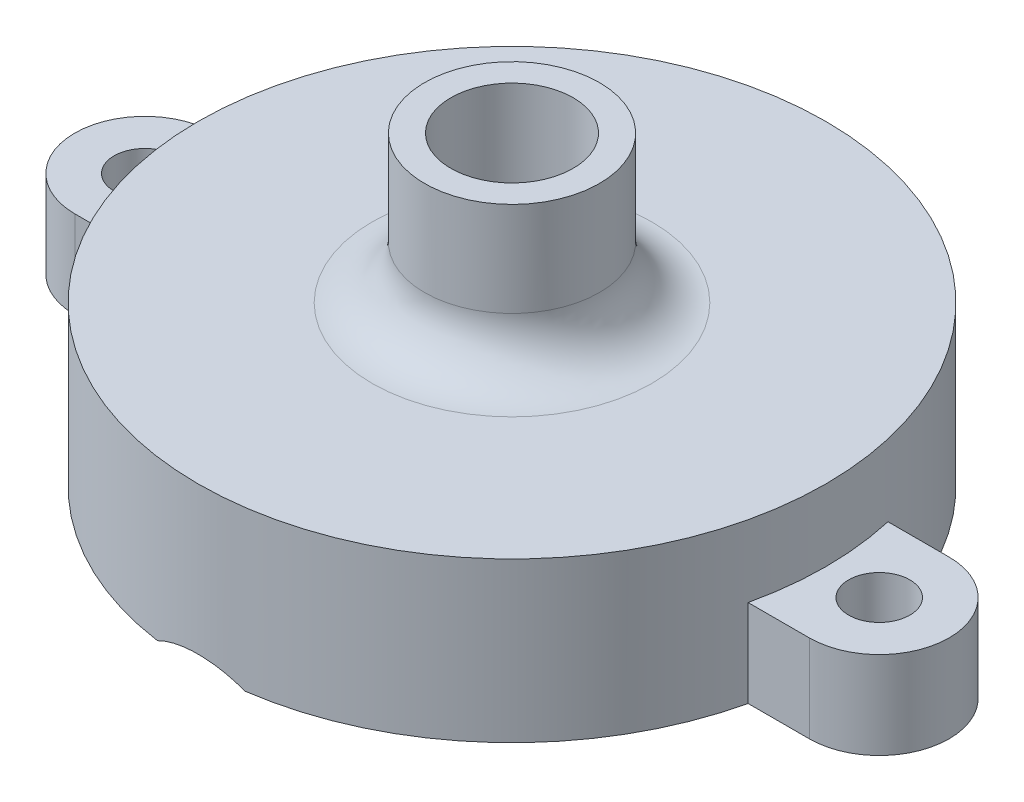
ISO-10303-21;
HEADER;
FILE_DESCRIPTION(('STEP AP214'),'2;1');
FILE_NAME('part.step','',(''),(''),'','','');
FILE_SCHEMA(('AUTOMOTIVE_DESIGN { 1 0 10303 214 1 1 1 1 }'));
ENDSEC;
DATA;
#1=APPLICATION_CONTEXT('core data for automotive mechanical design processes');
#2=APPLICATION_PROTOCOL_DEFINITION('international standard','automotive_design',2000,#1);
#3=PRODUCT_CONTEXT('',#1,'mechanical');
#4=PRODUCT('Part','Part','',(#3));
#5=PRODUCT_RELATED_PRODUCT_CATEGORY('part','',(#4));
#6=PRODUCT_DEFINITION_FORMATION('','',#4);
#7=PRODUCT_DEFINITION_CONTEXT('part definition',#1,'design');
#8=PRODUCT_DEFINITION('design','',#6,#7);
#9=PRODUCT_DEFINITION_SHAPE('','',#8);
#10=(LENGTH_UNIT() NAMED_UNIT(*) SI_UNIT(.MILLI.,.METRE.));
#11=(NAMED_UNIT(*) PLANE_ANGLE_UNIT() SI_UNIT($,.RADIAN.));
#12=(NAMED_UNIT(*) SI_UNIT($,.STERADIAN.) SOLID_ANGLE_UNIT());
#13=UNCERTAINTY_MEASURE_WITH_UNIT(LENGTH_MEASURE(1.E-05),#10,'distance_accuracy_value','');
#14=(GEOMETRIC_REPRESENTATION_CONTEXT(3) GLOBAL_UNCERTAINTY_ASSIGNED_CONTEXT((#13)) GLOBAL_UNIT_ASSIGNED_CONTEXT((#10,
#11,#12)) REPRESENTATION_CONTEXT('',''));
#15=CARTESIAN_POINT('',(0.,0.,0.));
#16=DIRECTION('',(0.,0.,1.));
#17=DIRECTION('',(1.,0.,0.));
#18=AXIS2_PLACEMENT_3D('',#15,#16,#17);
#19=CARTESIAN_POINT('',(0.,0.,0.));
#20=DIRECTION('',(0.,-1.,0.));
#21=DIRECTION('',(0.,0.,-1.));
#22=AXIS2_PLACEMENT_3D('',#19,#20,#21);
#23=CYLINDRICAL_SURFACE('',#22,17.95);
#24=CARTESIAN_POINT('',(0.,7.6,0.));
#25=DIRECTION('',(0.,-1.,0.));
#26=DIRECTION('',(0.,0.,-1.));
#27=AXIS2_PLACEMENT_3D('',#24,#25,#26);
#28=CIRCLE('',#27,17.95);
#29=CARTESIAN_POINT('',(0.,7.6,-17.95));
#30=VERTEX_POINT('',#29);
#31=EDGE_CURVE('E190',#30,#30,#28,.T.);
#32=ORIENTED_EDGE('',*,*,#31,.T.);
#33=EDGE_LOOP('',(#32));
#34=FACE_BOUND('',#33,.T.);
#35=CARTESIAN_POINT('',(0.,-1.5,0.));
#36=DIRECTION('',(0.,-1.,0.));
#37=DIRECTION('',(0.,0.,-1.));
#38=AXIS2_PLACEMENT_3D('',#35,#36,#37);
#39=CIRCLE('',#38,17.95);
#40=CARTESIAN_POINT('',(-2.5,-1.5,17.7750527425378));
#41=VERTEX_POINT('',#40);
#42=CARTESIAN_POINT('',(-17.4986428045149,-1.5,3.99999999999999));
#43=VERTEX_POINT('',#42);
#44=EDGE_CURVE('E194',#41,#43,#39,.T.);
#45=ORIENTED_EDGE('',*,*,#44,.F.);
#46=CARTESIAN_POINT('',(-2.5,-1.5,17.7750527425378));
#47=CARTESIAN_POINT('',(-2.38165113708189,-1.43165597801078,17.7917083045529));
#48=CARTESIAN_POINT('',(-2.26039505101105,-1.36813357291319,17.8075474890646));
#49=CARTESIAN_POINT('',(-2.01287040770248,-1.25114693819213,17.8372165345942));
#50=CARTESIAN_POINT('',(-1.88660122710851,-1.19768396418829,17.8510461447277));
#51=CARTESIAN_POINT('',(-1.62993569625732,-1.10126845139301,17.8763098734586));
#52=CARTESIAN_POINT('',(-1.49954108462071,-1.05831154984302,17.8877449861119));
#53=CARTESIAN_POINT('',(-1.23547409439407,-0.983226774818197,17.9079208405242));
#54=CARTESIAN_POINT('',(-1.10180193391693,-0.951098182832611,17.9166617610528));
#55=CARTESIAN_POINT('',(-0.831957783813571,-0.897908565383739,17.9312192555116));
#56=CARTESIAN_POINT('',(-0.69578315058931,-0.876860033971758,17.9370325278613));
#57=CARTESIAN_POINT('',(-0.422016425013952,-0.846064175857757,17.9455610811594));
#58=CARTESIAN_POINT('',(-0.284423855339676,-0.836320789132908,17.9482752820394));
#59=CARTESIAN_POINT('',(-0.00891287370729469,-0.828236496376056,17.9505262796558));
#60=CARTESIAN_POINT('',(0.129005447090246,-0.829892708581293,17.9500638794216));
#61=CARTESIAN_POINT('',(0.404187339104188,-0.844586173935835,17.945976368115));
#62=CARTESIAN_POINT('',(0.541450910756215,-0.857623419511901,17.9423512591473));
#63=CARTESIAN_POINT('',(0.812305514344321,-0.894686955672647,17.9321152527304));
#64=CARTESIAN_POINT('',(0.945920855748549,-0.918548409623978,17.9255491603667));
#65=CARTESIAN_POINT('',(1.21056632365078,-0.976995543020805,17.9096229900142));
#66=CARTESIAN_POINT('',(1.34159733202195,-1.01157749444263,17.9002638833306));
#67=CARTESIAN_POINT('',(1.60008414794944,-1.09113972239899,17.8790109850652));
#68=CARTESIAN_POINT('',(1.7275437499539,-1.13610845430531,17.8671200087271));
#69=CARTESIAN_POINT('',(1.97815972441054,-1.23610156060522,17.8411109999684));
#70=CARTESIAN_POINT('',(2.10131836907358,-1.29112052668128,17.8269941659017));
#71=CARTESIAN_POINT('',(2.26910861070084,-1.37435293084501,17.806063908259));
#72=CARTESIAN_POINT('',(2.31589669281383,-1.39849147348164,17.8000368905864));
#73=CARTESIAN_POINT('',(2.40859618045207,-1.44818400055934,17.7877302085256));
#74=CARTESIAN_POINT('',(2.45450871759253,-1.47373596407677,17.7814509082006));
#75=CARTESIAN_POINT('',(2.5,-1.5,17.7750527425378));
#76=B_SPLINE_CURVE_WITH_KNOTS('',3,(#46,#47,#48,#49,#50,#51,#52,#53,#54,#55,#56,#57,#58,#59,#60,
#61,#62,#63,#64,#65,#66,#67,#68,#69,#70,#71,#72,#73,#74,#75),.UNSPECIFIED.,.F.,.F.,(4,2,2,2,2,2,
2,2,2,2,2,2,2,2,4),(0.,0.412923213001316,0.825897932995578,1.23870086854427,1.65147640722452,
2.06471640643398,2.47810038147286,2.89137985890689,3.30465906133405,3.71184560030374,
4.11889069980619,4.52548553830724,4.93186221767634,5.09081642814064,5.2495489609334),.UNSPECIFIED.);
#77=CARTESIAN_POINT('',(2.5,-1.5,17.7750527425378));
#78=VERTEX_POINT('',#77);
#79=EDGE_CURVE('E55',#41,#78,#76,.T.);
#80=ORIENTED_EDGE('',*,*,#79,.T.);
#81=CARTESIAN_POINT('',(17.4986428045149,-1.5,3.99999999999999));
#82=VERTEX_POINT('',#81);
#83=EDGE_CURVE('E200',#82,#78,#39,.T.);
#84=ORIENTED_EDGE('',*,*,#83,.F.);
#85=DIRECTION('',(0.,-1.,0.));
#86=VECTOR('',#85,1.);
#87=CARTESIAN_POINT('',(17.4986428045149,3.5,3.99999999999999));
#88=LINE('',#87,#86);
#89=CARTESIAN_POINT('',(17.4986428045149,3.5,4.));
#90=VERTEX_POINT('',#89);
#91=EDGE_CURVE('E259',#90,#82,#88,.T.);
#92=ORIENTED_EDGE('',*,*,#91,.F.);
#93=CARTESIAN_POINT('',(0.,3.5,0.));
#94=DIRECTION('',(0.,-1.,0.));
#95=DIRECTION('',(0.,0.,1.));
#96=AXIS2_PLACEMENT_3D('',#93,#94,#95);
#97=CIRCLE('',#96,17.95);
#98=CARTESIAN_POINT('',(17.4986428045149,3.5,-4.));
#99=VERTEX_POINT('',#98);
#100=EDGE_CURVE('E261',#99,#90,#97,.T.);
#101=ORIENTED_EDGE('',*,*,#100,.F.);
#102=DIRECTION('',(0.,-1.,0.));
#103=VECTOR('',#102,1.);
#104=CARTESIAN_POINT('',(17.4986428045149,3.5,-4.));
#105=LINE('',#104,#103);
#106=CARTESIAN_POINT('',(17.4986428045149,-1.5,-4.));
#107=VERTEX_POINT('',#106);
#108=EDGE_CURVE('E263',#99,#107,#105,.T.);
#109=ORIENTED_EDGE('',*,*,#108,.T.);
#110=CARTESIAN_POINT('',(-17.4986428045149,-1.5,-4.));
#111=VERTEX_POINT('',#110);
#112=EDGE_CURVE('E195',#111,#107,#39,.T.);
#113=ORIENTED_EDGE('',*,*,#112,.F.);
#114=DIRECTION('',(0.,-1.,0.));
#115=VECTOR('',#114,1.);
#116=CARTESIAN_POINT('',(-17.4986428045149,3.5,-4.));
#117=LINE('',#116,#115);
#118=CARTESIAN_POINT('',(-17.4986428045149,3.5,-4.));
#119=VERTEX_POINT('',#118);
#120=EDGE_CURVE('E311',#119,#111,#117,.T.);
#121=ORIENTED_EDGE('',*,*,#120,.F.);
#122=CARTESIAN_POINT('',(0.,3.5,0.));
#123=DIRECTION('',(0.,1.,0.));
#124=DIRECTION('',(0.,0.,1.));
#125=AXIS2_PLACEMENT_3D('',#122,#123,#124);
#126=CIRCLE('',#125,17.95);
#127=CARTESIAN_POINT('',(-17.4986428045149,3.5,3.99999999999999));
#128=VERTEX_POINT('',#127);
#129=EDGE_CURVE('E293',#119,#128,#126,.T.);
#130=ORIENTED_EDGE('',*,*,#129,.T.);
#131=DIRECTION('',(0.,-1.,0.));
#132=VECTOR('',#131,1.);
#133=CARTESIAN_POINT('',(-17.4986428045149,3.5,3.99999999999999));
#134=LINE('',#133,#132);
#135=EDGE_CURVE('E168',#128,#43,#134,.T.);
#136=ORIENTED_EDGE('',*,*,#135,.T.);
#137=EDGE_LOOP('',(#45,#80,#84,#92,#101,#109,#113,#121,#130,#136));
#138=FACE_BOUND('',#137,.T.);
#139=ADVANCED_FACE('F39',(#34,#138),#23,.T.);
#140=CARTESIAN_POINT('',(0.,0.,0.));
#141=DIRECTION('',(0.,-1.,0.));
#142=DIRECTION('',(0.,0.,-1.));
#143=AXIS2_PLACEMENT_3D('',#140,#141,#142);
#144=CYLINDRICAL_SURFACE('',#143,15.45);
#145=CARTESIAN_POINT('',(0.,6.,0.));
#146=DIRECTION('',(0.,-1.,0.));
#147=DIRECTION('',(0.,0.,-1.));
#148=AXIS2_PLACEMENT_3D('',#145,#146,#147);
#149=CIRCLE('',#148,15.45);
#150=CARTESIAN_POINT('',(0.,6.,-15.45));
#151=VERTEX_POINT('',#150);
#152=EDGE_CURVE('E212',#151,#151,#149,.T.);
#153=ORIENTED_EDGE('',*,*,#152,.F.);
#154=EDGE_LOOP('',(#153));
#155=FACE_BOUND('',#154,.T.);
#156=CARTESIAN_POINT('',(0.,-1.5,0.));
#157=DIRECTION('',(0.,1.,0.));
#158=DIRECTION('',(0.,0.,1.));
#159=AXIS2_PLACEMENT_3D('',#156,#157,#158);
#160=CIRCLE('',#159,15.45);
#161=CARTESIAN_POINT('',(3.5,-1.5,15.048338778749));
#162=VERTEX_POINT('',#161);
#163=CARTESIAN_POINT('',(2.5,-1.5,15.2463930160546));
#164=VERTEX_POINT('',#163);
#165=EDGE_CURVE('E154',#162,#164,#160,.F.);
#166=ORIENTED_EDGE('',*,*,#165,.T.);
#167=CARTESIAN_POINT('',(2.5,-1.5,15.2463930160546));
#168=CARTESIAN_POINT('',(2.38281995173812,-1.43233148674007,15.2656187256161));
#169=CARTESIAN_POINT('',(2.26275670290411,-1.3693699615778,15.2839078279045));
#170=CARTESIAN_POINT('',(2.01762719800361,-1.25327854991161,15.318188728294));
#171=CARTESIAN_POINT('',(1.89256005056537,-1.2001504246534,15.3341801147402));
#172=CARTESIAN_POINT('',(1.63824674441847,-1.10417483114348,15.3634322251576));
#173=CARTESIAN_POINT('',(1.50900118321424,-1.06132590030279,15.3766933375714));
#174=CARTESIAN_POINT('',(1.24719469528621,-0.986260231077899,15.4001386027246));
#175=CARTESIAN_POINT('',(1.11463404198737,-0.954042618925864,15.4103230083269));
#176=CARTESIAN_POINT('',(0.846922707856259,-0.900483748090567,15.4273535441234));
#177=CARTESIAN_POINT('',(0.711768613493579,-0.879158013592323,15.4341949088873));
#178=CARTESIAN_POINT('',(0.439986857041939,-0.847644492283323,15.4443325711815));
#179=CARTESIAN_POINT('',(0.303358697824834,-0.837460589674274,15.4476276324131));
#180=CARTESIAN_POINT('',(0.0297487092738467,-0.828343015097297,15.4505768374435));
#181=CARTESIAN_POINT('',(-0.107232936424439,-0.829404357804788,15.4502325946452));
#182=CARTESIAN_POINT('',(-0.380590416904757,-0.842755348489234,15.4459164918666));
#183=CARTESIAN_POINT('',(-0.516966252579595,-0.855044979913104,15.4419446372343));
#184=CARTESIAN_POINT('',(-0.78542465972773,-0.890382527067282,15.4305963169205));
#185=CARTESIAN_POINT('',(-0.917538833002115,-0.91321322370042,15.423288625506));
#186=CARTESIAN_POINT('',(-1.1792581813869,-0.969339536075635,15.4054875792462));
#187=CARTESIAN_POINT('',(-1.30886420326875,-1.00263155217468,15.3949953202233));
#188=CARTESIAN_POINT('',(-1.56462776078282,-1.07936356555427,15.3711068697123));
#189=CARTESIAN_POINT('',(-1.69078824095913,-1.1227945743614,15.3577132511067));
#190=CARTESIAN_POINT('',(-1.93893003404423,-1.21945832301638,15.3283608746693));
#191=CARTESIAN_POINT('',(-2.06091340327422,-1.2726861553246,15.31240340166));
#192=CARTESIAN_POINT('',(-2.23478992439088,-1.35694401763126,15.2876170388389));
#193=CARTESIAN_POINT('',(-2.28863779625233,-1.38425482403168,15.2796448539173));
#194=CARTESIAN_POINT('',(-2.3951760488629,-1.44073533100604,15.2633066713848));
#195=CARTESIAN_POINT('',(-2.44786814973157,-1.46990197560621,15.2549413268314));
#196=CARTESIAN_POINT('',(-2.5,-1.5,15.2463930160546));
#197=B_SPLINE_CURVE_WITH_KNOTS('',3,(#167,#168,#169,#170,#171,#172,#173,#174,#175,#176,#177,
#178,#179,#180,#181,#182,#183,#184,#185,#186,#187,#188,#189,#190,#191,#192,#193,#194,#195,#196),
.UNSPECIFIED.,.F.,.F.,(4,2,2,2,2,2,2,2,2,2,2,2,2,2,4),(0.,0.409923833638007,0.819921017228059,
1.22985982917066,1.63976494062658,2.05025267044515,2.46088345659498,2.87133220651456,
3.28178035133907,3.68412399763969,4.08632935254207,4.48817948727067,4.88982886769605,
5.07250054419904,5.25487883603414),.UNSPECIFIED.);
#198=CARTESIAN_POINT('',(-2.5,-1.5,15.2463930160546));
#199=VERTEX_POINT('',#198);
#200=EDGE_CURVE('E140',#164,#199,#197,.T.);
#201=ORIENTED_EDGE('',*,*,#200,.T.);
#202=CARTESIAN_POINT('',(-3.5,-1.5,15.048338778749));
#203=VERTEX_POINT('',#202);
#204=EDGE_CURVE('E150',#199,#203,#160,.F.);
#205=ORIENTED_EDGE('',*,*,#204,.T.);
#206=DIRECTION('',(0.,-1.,0.));
#207=VECTOR('',#206,1.);
#208=CARTESIAN_POINT('',(-3.5,0.,15.048338778749));
#209=LINE('',#208,#207);
#210=CARTESIAN_POINT('',(-3.5,0.,15.048338778749));
#211=VERTEX_POINT('',#210);
#212=EDGE_CURVE('E319',#203,#211,#209,.F.);
#213=ORIENTED_EDGE('',*,*,#212,.T.);
#214=CARTESIAN_POINT('',(0.,0.,0.));
#215=DIRECTION('',(0.,-1.,0.));
#216=DIRECTION('',(0.,0.,-1.));
#217=AXIS2_PLACEMENT_3D('',#214,#215,#216);
#218=CIRCLE('',#217,15.45);
#219=CARTESIAN_POINT('',(3.5,0.,15.048338778749));
#220=VERTEX_POINT('',#219);
#221=EDGE_CURVE('E208',#211,#220,#218,.T.);
#222=ORIENTED_EDGE('',*,*,#221,.T.);
#223=DIRECTION('',(0.,-1.,0.));
#224=VECTOR('',#223,1.);
#225=CARTESIAN_POINT('',(3.5,0.,15.048338778749));
#226=LINE('',#225,#224);
#227=EDGE_CURVE('E167',#220,#162,#226,.T.);
#228=ORIENTED_EDGE('',*,*,#227,.T.);
#229=EDGE_LOOP('',(#166,#201,#205,#213,#222,#228));
#230=FACE_BOUND('',#229,.T.);
#231=ADVANCED_FACE('F148',(#155,#230),#144,.F.);
#232=CARTESIAN_POINT('',(16.65,-1.5,0.));
#233=DIRECTION('',(0.,-1.,0.));
#234=DIRECTION('',(0.,0.,-1.));
#235=AXIS2_PLACEMENT_3D('',#232,#233,#234);
#236=PLANE('',#235);
#237=CARTESIAN_POINT('',(-21.,-1.5,0.));
#238=DIRECTION('',(0.,-1.,0.));
#239=DIRECTION('',(0.,0.,-1.));
#240=AXIS2_PLACEMENT_3D('',#237,#238,#239);
#241=CIRCLE('',#240,1.75);
#242=CARTESIAN_POINT('',(-21.,-1.5,-1.75));
#243=VERTEX_POINT('',#242);
#244=EDGE_CURVE('E280',#243,#243,#241,.T.);
#245=ORIENTED_EDGE('',*,*,#244,.F.);
#246=EDGE_LOOP('',(#245));
#247=FACE_BOUND('',#246,.T.);
#248=CARTESIAN_POINT('',(21.,-1.5,0.));
#249=DIRECTION('',(0.,1.,0.));
#250=DIRECTION('',(0.,0.,-1.));
#251=AXIS2_PLACEMENT_3D('',#248,#249,#250);
#252=CIRCLE('',#251,1.75);
#253=CARTESIAN_POINT('',(21.,-1.5,-1.75));
#254=VERTEX_POINT('',#253);
#255=EDGE_CURVE('E368',#254,#254,#252,.T.);
#256=ORIENTED_EDGE('',*,*,#255,.T.);
#257=EDGE_LOOP('',(#256));
#258=FACE_BOUND('',#257,.T.);
#259=ORIENTED_EDGE('',*,*,#83,.T.);
#260=DIRECTION('',(0.,0.,1.));
#261=VECTOR('',#260,1.);
#262=CARTESIAN_POINT('',(2.5,-1.5,12.73));
#263=LINE('',#262,#261);
#264=EDGE_CURVE('E11',#78,#164,#263,.F.);
#265=ORIENTED_EDGE('',*,*,#264,.T.);
#266=ORIENTED_EDGE('',*,*,#165,.F.);
#267=DIRECTION('',(0.,0.,1.));
#268=VECTOR('',#267,1.);
#269=CARTESIAN_POINT('',(3.5,-1.5,-17.951));
#270=LINE('',#269,#268);
#271=CARTESIAN_POINT('',(3.5,-1.5,16.2779759183997));
#272=VERTEX_POINT('',#271);
#273=EDGE_CURVE('E324',#162,#272,#270,.T.);
#274=ORIENTED_EDGE('',*,*,#273,.T.);
#275=CARTESIAN_POINT('',(0.,-1.5,0.));
#276=DIRECTION('',(0.,-1.,0.));
#277=DIRECTION('',(0.,0.,-1.));
#278=AXIS2_PLACEMENT_3D('',#275,#276,#277);
#279=CIRCLE('',#278,16.65);
#280=CARTESIAN_POINT('',(-3.5,-1.5,16.2779759183997));
#281=VERTEX_POINT('',#280);
#282=EDGE_CURVE('E199',#281,#272,#279,.T.);
#283=ORIENTED_EDGE('',*,*,#282,.F.);
#284=DIRECTION('',(0.,0.,1.));
#285=VECTOR('',#284,1.);
#286=CARTESIAN_POINT('',(-3.5,-1.5,-17.951));
#287=LINE('',#286,#285);
#288=EDGE_CURVE('E160',#203,#281,#287,.T.);
#289=ORIENTED_EDGE('',*,*,#288,.F.);
#290=ORIENTED_EDGE('',*,*,#204,.F.);
#291=DIRECTION('',(0.,0.,1.));
#292=VECTOR('',#291,1.);
#293=CARTESIAN_POINT('',(-2.5,-1.5,12.73));
#294=LINE('',#293,#292);
#295=EDGE_CURVE('E48',#199,#41,#294,.T.);
#296=ORIENTED_EDGE('',*,*,#295,.T.);
#297=ORIENTED_EDGE('',*,*,#44,.T.);
#298=DIRECTION('',(-1.,0.,0.));
#299=VECTOR('',#298,1.);
#300=CARTESIAN_POINT('',(-21.,-1.5,4.));
#301=LINE('',#300,#299);
#302=CARTESIAN_POINT('',(-21.,-1.5,4.));
#303=VERTEX_POINT('',#302);
#304=EDGE_CURVE('E289',#43,#303,#301,.T.);
#305=ORIENTED_EDGE('',*,*,#304,.T.);
#306=CARTESIAN_POINT('',(-21.,-1.5,0.));
#307=DIRECTION('',(0.,-1.,0.));
#308=DIRECTION('',(0.,0.,-1.));
#309=AXIS2_PLACEMENT_3D('',#306,#307,#308);
#310=CIRCLE('',#309,4.);
#311=CARTESIAN_POINT('',(-21.,-1.5,-4.));
#312=VERTEX_POINT('',#311);
#313=EDGE_CURVE('E279',#303,#312,#310,.T.);
#314=ORIENTED_EDGE('',*,*,#313,.T.);
#315=DIRECTION('',(1.,0.,0.));
#316=VECTOR('',#315,1.);
#317=CARTESIAN_POINT('',(-21.,-1.5,-4.));
#318=LINE('',#317,#316);
#319=EDGE_CURVE('E304',#312,#111,#318,.T.);
#320=ORIENTED_EDGE('',*,*,#319,.T.);
#321=ORIENTED_EDGE('',*,*,#112,.T.);
#322=DIRECTION('',(-1.,0.,0.));
#323=VECTOR('',#322,1.);
#324=CARTESIAN_POINT('',(21.,-1.5,-4.));
#325=LINE('',#324,#323);
#326=CARTESIAN_POINT('',(21.,-1.5,-4.));
#327=VERTEX_POINT('',#326);
#328=EDGE_CURVE('E424',#327,#107,#325,.T.);
#329=ORIENTED_EDGE('',*,*,#328,.F.);
#330=CARTESIAN_POINT('',(21.,-1.5,0.));
#331=DIRECTION('',(0.,1.,0.));
#332=DIRECTION('',(0.,0.,-1.));
#333=AXIS2_PLACEMENT_3D('',#330,#331,#332);
#334=CIRCLE('',#333,4.);
#335=CARTESIAN_POINT('',(21.,-1.5,4.));
#336=VERTEX_POINT('',#335);
#337=EDGE_CURVE('E427',#336,#327,#334,.T.);
#338=ORIENTED_EDGE('',*,*,#337,.F.);
#339=DIRECTION('',(1.,0.,0.));
#340=VECTOR('',#339,1.);
#341=CARTESIAN_POINT('',(21.,-1.5,4.));
#342=LINE('',#341,#340);
#343=EDGE_CURVE('E256',#82,#336,#342,.T.);
#344=ORIENTED_EDGE('',*,*,#343,.F.);
#345=EDGE_LOOP('',(#259,#265,#266,#274,#283,#289,#290,#296,#297,#305,#314,#320,#321,#329,#338,#344));
#346=FACE_BOUND('',#345,.T.);
#347=ADVANCED_FACE('F158',(#247,#258,#346),#236,.T.);
#348=CARTESIAN_POINT('',(15.45,0.,0.));
#349=DIRECTION('',(0.,-1.,0.));
#350=DIRECTION('',(0.,0.,-1.));
#351=AXIS2_PLACEMENT_3D('',#348,#349,#350);
#352=PLANE('',#351);
#353=CARTESIAN_POINT('',(0.,0.,0.));
#354=DIRECTION('',(0.,-1.,0.));
#355=DIRECTION('',(0.,0.,-1.));
#356=AXIS2_PLACEMENT_3D('',#353,#354,#355);
#357=CIRCLE('',#356,16.65);
#358=CARTESIAN_POINT('',(-3.5,0.,16.2779759183997));
#359=VERTEX_POINT('',#358);
#360=CARTESIAN_POINT('',(3.5,0.,16.2779759183997));
#361=VERTEX_POINT('',#360);
#362=EDGE_CURVE('E204',#359,#361,#357,.T.);
#363=ORIENTED_EDGE('',*,*,#362,.T.);
#364=DIRECTION('',(0.,0.,1.));
#365=VECTOR('',#364,1.);
#366=CARTESIAN_POINT('',(3.5,0.,-17.951));
#367=LINE('',#366,#365);
#368=EDGE_CURVE('E327',#220,#361,#367,.T.);
#369=ORIENTED_EDGE('',*,*,#368,.F.);
#370=ORIENTED_EDGE('',*,*,#221,.F.);
#371=DIRECTION('',(0.,0.,1.));
#372=VECTOR('',#371,1.);
#373=CARTESIAN_POINT('',(-3.5,0.,-17.951));
#374=LINE('',#373,#372);
#375=EDGE_CURVE('E172',#211,#359,#374,.T.);
#376=ORIENTED_EDGE('',*,*,#375,.T.);
#377=EDGE_LOOP('',(#363,#369,#370,#376));
#378=FACE_BOUND('',#377,.T.);
#379=ADVANCED_FACE('F336',(#378),#352,.T.);
#380=CARTESIAN_POINT('',(0.,0.,0.));
#381=DIRECTION('',(0.,-1.,0.));
#382=DIRECTION('',(0.,0.,-1.));
#383=AXIS2_PLACEMENT_3D('',#380,#381,#382);
#384=CYLINDRICAL_SURFACE('',#383,16.65);
#385=ORIENTED_EDGE('',*,*,#282,.T.);
#386=DIRECTION('',(0.,-1.,0.));
#387=VECTOR('',#386,1.);
#388=CARTESIAN_POINT('',(3.5,0.,16.2779759183997));
#389=LINE('',#388,#387);
#390=EDGE_CURVE('E178',#272,#361,#389,.F.);
#391=ORIENTED_EDGE('',*,*,#390,.T.);
#392=ORIENTED_EDGE('',*,*,#362,.F.);
#393=DIRECTION('',(0.,-1.,0.));
#394=VECTOR('',#393,1.);
#395=CARTESIAN_POINT('',(-3.5,0.,16.2779759183997));
#396=LINE('',#395,#394);
#397=EDGE_CURVE('E174',#359,#281,#396,.T.);
#398=ORIENTED_EDGE('',*,*,#397,.T.);
#399=EDGE_LOOP('',(#385,#391,#392,#398));
#400=FACE_BOUND('',#399,.T.);
#401=ADVANCED_FACE('F339',(#400),#384,.F.);
#402=CARTESIAN_POINT('',(0.,0.,0.));
#403=DIRECTION('',(0.,-1.,0.));
#404=DIRECTION('',(0.,0.,-1.));
#405=AXIS2_PLACEMENT_3D('',#402,#403,#404);
#406=CYLINDRICAL_SURFACE('',#405,3.5);
#407=CARTESIAN_POINT('',(0.,6.,0.));
#408=DIRECTION('',(0.,-1.,0.));
#409=DIRECTION('',(0.,0.,-1.));
#410=AXIS2_PLACEMENT_3D('',#407,#408,#409);
#411=CIRCLE('',#410,3.5);
#412=CARTESIAN_POINT('',(0.,6.,-3.5));
#413=VERTEX_POINT('',#412);
#414=EDGE_CURVE('E216',#413,#413,#411,.T.);
#415=ORIENTED_EDGE('',*,*,#414,.T.);
#416=EDGE_LOOP('',(#415));
#417=FACE_BOUND('',#416,.T.);
#418=CARTESIAN_POINT('',(0.,16.,0.));
#419=DIRECTION('',(0.,-1.,0.));
#420=DIRECTION('',(0.,0.,-1.));
#421=AXIS2_PLACEMENT_3D('',#418,#419,#420);
#422=CIRCLE('',#421,3.5);
#423=CARTESIAN_POINT('',(0.,16.,-3.5));
#424=VERTEX_POINT('',#423);
#425=EDGE_CURVE('E182',#424,#424,#422,.T.);
#426=ORIENTED_EDGE('',*,*,#425,.F.);
#427=EDGE_LOOP('',(#426));
#428=FACE_BOUND('',#427,.T.);
#429=ADVANCED_FACE('F470',(#417,#428),#406,.F.);
#430=CARTESIAN_POINT('',(3.5,6.,0.));
#431=DIRECTION('',(0.,-1.,0.));
#432=DIRECTION('',(0.,0.,-1.));
#433=AXIS2_PLACEMENT_3D('',#430,#431,#432);
#434=PLANE('',#433);
#435=ORIENTED_EDGE('',*,*,#152,.T.);
#436=EDGE_LOOP('',(#435));
#437=FACE_BOUND('',#436,.T.);
#438=ORIENTED_EDGE('',*,*,#414,.F.);
#439=EDGE_LOOP('',(#438));
#440=FACE_BOUND('',#439,.T.);
#441=ADVANCED_FACE('F240',(#437,#440),#434,.T.);
#442=CARTESIAN_POINT('',(17.95,7.6,0.));
#443=DIRECTION('',(0.,1.,0.));
#444=DIRECTION('',(0.,0.,1.));
#445=AXIS2_PLACEMENT_3D('',#442,#443,#444);
#446=PLANE('',#445);
#447=CARTESIAN_POINT('',(0.,7.6,0.));
#448=DIRECTION('',(0.,1.,0.));
#449=DIRECTION('',(0.,0.,1.));
#450=AXIS2_PLACEMENT_3D('',#447,#448,#449);
#451=CIRCLE('',#450,8.);
#452=CARTESIAN_POINT('',(0.,7.6,8.));
#453=VERTEX_POINT('',#452);
#454=EDGE_CURVE('E220',#453,#453,#451,.F.);
#455=ORIENTED_EDGE('',*,*,#454,.T.);
#456=EDGE_LOOP('',(#455));
#457=FACE_BOUND('',#456,.T.);
#458=ORIENTED_EDGE('',*,*,#31,.F.);
#459=EDGE_LOOP('',(#458));
#460=FACE_BOUND('',#459,.T.);
#461=ADVANCED_FACE('F237',(#457,#460),#446,.T.);
#462=CARTESIAN_POINT('',(0.,0.,0.));
#463=DIRECTION('',(0.,-1.,0.));
#464=DIRECTION('',(0.,0.,-1.));
#465=AXIS2_PLACEMENT_3D('',#462,#463,#464);
#466=CYLINDRICAL_SURFACE('',#465,5.);
#467=CARTESIAN_POINT('',(0.,10.6,0.));
#468=DIRECTION('',(0.,1.,0.));
#469=DIRECTION('',(0.,0.,1.));
#470=AXIS2_PLACEMENT_3D('',#467,#468,#469);
#471=CIRCLE('',#470,5.);
#472=CARTESIAN_POINT('',(0.,10.6,5.));
#473=VERTEX_POINT('',#472);
#474=EDGE_CURVE('E145',#473,#473,#471,.T.);
#475=ORIENTED_EDGE('',*,*,#474,.T.);
#476=EDGE_LOOP('',(#475));
#477=FACE_BOUND('',#476,.T.);
#478=CARTESIAN_POINT('',(0.,16.,0.));
#479=DIRECTION('',(0.,-1.,0.));
#480=DIRECTION('',(0.,0.,-1.));
#481=AXIS2_PLACEMENT_3D('',#478,#479,#480);
#482=CIRCLE('',#481,5.);
#483=CARTESIAN_POINT('',(0.,16.,-5.));
#484=VERTEX_POINT('',#483);
#485=EDGE_CURVE('E186',#484,#484,#482,.T.);
#486=ORIENTED_EDGE('',*,*,#485,.T.);
#487=EDGE_LOOP('',(#486));
#488=FACE_BOUND('',#487,.T.);
#489=ADVANCED_FACE('F228',(#477,#488),#466,.T.);
#490=CARTESIAN_POINT('',(5.,16.,0.));
#491=DIRECTION('',(0.,1.,0.));
#492=DIRECTION('',(0.,0.,1.));
#493=AXIS2_PLACEMENT_3D('',#490,#491,#492);
#494=PLANE('',#493);
#495=ORIENTED_EDGE('',*,*,#425,.T.);
#496=EDGE_LOOP('',(#495));
#497=FACE_BOUND('',#496,.T.);
#498=ORIENTED_EDGE('',*,*,#485,.F.);
#499=EDGE_LOOP('',(#498));
#500=FACE_BOUND('',#499,.T.);
#501=ADVANCED_FACE('F234',(#497,#500),#494,.T.);
#502=CARTESIAN_POINT('',(0.,10.6,0.));
#503=DIRECTION('',(0.,1.,0.));
#504=DIRECTION('',(0.,0.,1.));
#505=AXIS2_PLACEMENT_3D('',#502,#503,#504);
#506=TOROIDAL_SURFACE('',#505,8.,3.);
#507=ORIENTED_EDGE('',*,*,#474,.F.);
#508=EDGE_LOOP('',(#507));
#509=FACE_BOUND('',#508,.T.);
#510=ORIENTED_EDGE('',*,*,#454,.F.);
#511=EDGE_LOOP('',(#510));
#512=FACE_BOUND('',#511,.T.);
#513=ADVANCED_FACE('F41',(#509,#512),#506,.F.);
#514=CARTESIAN_POINT('',(3.5,0.,-17.951));
#515=DIRECTION('',(-1.,0.,0.));
#516=DIRECTION('',(0.,0.,1.));
#517=AXIS2_PLACEMENT_3D('',#514,#515,#516);
#518=PLANE('',#517);
#519=ORIENTED_EDGE('',*,*,#390,.F.);
#520=ORIENTED_EDGE('',*,*,#273,.F.);
#521=ORIENTED_EDGE('',*,*,#227,.F.);
#522=ORIENTED_EDGE('',*,*,#368,.T.);
#523=EDGE_LOOP('',(#519,#520,#521,#522));
#524=FACE_BOUND('',#523,.T.);
#525=ADVANCED_FACE('F233',(#524),#518,.F.);
#526=CARTESIAN_POINT('',(-3.5,0.,-17.951));
#527=DIRECTION('',(1.,0.,0.));
#528=DIRECTION('',(0.,0.,-1.));
#529=AXIS2_PLACEMENT_3D('',#526,#527,#528);
#530=PLANE('',#529);
#531=ORIENTED_EDGE('',*,*,#397,.F.);
#532=ORIENTED_EDGE('',*,*,#375,.F.);
#533=ORIENTED_EDGE('',*,*,#212,.F.);
#534=ORIENTED_EDGE('',*,*,#288,.T.);
#535=EDGE_LOOP('',(#531,#532,#533,#534));
#536=FACE_BOUND('',#535,.T.);
#537=ADVANCED_FACE('F340',(#536),#530,.F.);
#538=CARTESIAN_POINT('',(-21.,3.5,0.));
#539=DIRECTION('',(0.,-1.,0.));
#540=DIRECTION('',(0.,0.,-1.));
#541=AXIS2_PLACEMENT_3D('',#538,#539,#540);
#542=CYLINDRICAL_SURFACE('',#541,4.);
#543=ORIENTED_EDGE('',*,*,#313,.F.);
#544=DIRECTION('',(0.,-1.,0.));
#545=VECTOR('',#544,1.);
#546=CARTESIAN_POINT('',(-21.,3.5,4.));
#547=LINE('',#546,#545);
#548=CARTESIAN_POINT('',(-21.,3.5,4.));
#549=VERTEX_POINT('',#548);
#550=EDGE_CURVE('E163',#549,#303,#547,.T.);
#551=ORIENTED_EDGE('',*,*,#550,.F.);
#552=CARTESIAN_POINT('',(-21.,3.5,0.));
#553=DIRECTION('',(0.,-1.,0.));
#554=DIRECTION('',(0.,0.,-1.));
#555=AXIS2_PLACEMENT_3D('',#552,#553,#554);
#556=CIRCLE('',#555,4.);
#557=CARTESIAN_POINT('',(-21.,3.5,-4.));
#558=VERTEX_POINT('',#557);
#559=EDGE_CURVE('E284',#549,#558,#556,.T.);
#560=ORIENTED_EDGE('',*,*,#559,.T.);
#561=DIRECTION('',(0.,-1.,0.));
#562=VECTOR('',#561,1.);
#563=CARTESIAN_POINT('',(-21.,3.5,-4.));
#564=LINE('',#563,#562);
#565=EDGE_CURVE('E300',#558,#312,#564,.T.);
#566=ORIENTED_EDGE('',*,*,#565,.T.);
#567=EDGE_LOOP('',(#543,#551,#560,#566));
#568=FACE_BOUND('',#567,.T.);
#569=ADVANCED_FACE('F342',(#568),#542,.T.);
#570=CARTESIAN_POINT('',(-21.,3.5,4.));
#571=DIRECTION('',(0.,0.,1.));
#572=DIRECTION('',(1.,0.,0.));
#573=AXIS2_PLACEMENT_3D('',#570,#571,#572);
#574=PLANE('',#573);
#575=ORIENTED_EDGE('',*,*,#304,.F.);
#576=ORIENTED_EDGE('',*,*,#135,.F.);
#577=DIRECTION('',(-1.,0.,0.));
#578=VECTOR('',#577,1.);
#579=CARTESIAN_POINT('',(-21.,3.5,4.));
#580=LINE('',#579,#578);
#581=EDGE_CURVE('E296',#128,#549,#580,.T.);
#582=ORIENTED_EDGE('',*,*,#581,.T.);
#583=ORIENTED_EDGE('',*,*,#550,.T.);
#584=EDGE_LOOP('',(#575,#576,#582,#583));
#585=FACE_BOUND('',#584,.T.);
#586=ADVANCED_FACE('F348',(#585),#574,.T.);
#587=CARTESIAN_POINT('',(-21.,3.5,-4.));
#588=DIRECTION('',(0.,0.,-1.));
#589=DIRECTION('',(-1.,0.,0.));
#590=AXIS2_PLACEMENT_3D('',#587,#588,#589);
#591=PLANE('',#590);
#592=ORIENTED_EDGE('',*,*,#319,.F.);
#593=ORIENTED_EDGE('',*,*,#565,.F.);
#594=DIRECTION('',(1.,0.,0.));
#595=VECTOR('',#594,1.);
#596=CARTESIAN_POINT('',(-21.,3.5,-4.));
#597=LINE('',#596,#595);
#598=EDGE_CURVE('E288',#558,#119,#597,.T.);
#599=ORIENTED_EDGE('',*,*,#598,.T.);
#600=ORIENTED_EDGE('',*,*,#120,.T.);
#601=EDGE_LOOP('',(#592,#593,#599,#600));
#602=FACE_BOUND('',#601,.T.);
#603=ADVANCED_FACE('F406',(#602),#591,.T.);
#604=CARTESIAN_POINT('',(-21.,3.5,0.));
#605=DIRECTION('',(0.,-1.,0.));
#606=DIRECTION('',(0.,0.,-1.));
#607=AXIS2_PLACEMENT_3D('',#604,#605,#606);
#608=PLANE('',#607);
#609=CARTESIAN_POINT('',(-21.,3.5,0.));
#610=DIRECTION('',(0.,-1.,0.));
#611=DIRECTION('',(0.,0.,-1.));
#612=AXIS2_PLACEMENT_3D('',#609,#610,#611);
#613=CIRCLE('',#612,1.75);
#614=CARTESIAN_POINT('',(-21.,3.5,-1.75));
#615=VERTEX_POINT('',#614);
#616=EDGE_CURVE('E275',#615,#615,#613,.T.);
#617=ORIENTED_EDGE('',*,*,#616,.T.);
#618=EDGE_LOOP('',(#617));
#619=FACE_BOUND('',#618,.T.);
#620=ORIENTED_EDGE('',*,*,#559,.F.);
#621=ORIENTED_EDGE('',*,*,#581,.F.);
#622=ORIENTED_EDGE('',*,*,#129,.F.);
#623=ORIENTED_EDGE('',*,*,#598,.F.);
#624=EDGE_LOOP('',(#620,#621,#622,#623));
#625=FACE_BOUND('',#624,.T.);
#626=ADVANCED_FACE('F402',(#619,#625),#608,.F.);
#627=CARTESIAN_POINT('',(-21.,3.5,0.));
#628=DIRECTION('',(0.,-1.,0.));
#629=DIRECTION('',(0.,0.,-1.));
#630=AXIS2_PLACEMENT_3D('',#627,#628,#629);
#631=CYLINDRICAL_SURFACE('',#630,1.75);
#632=ORIENTED_EDGE('',*,*,#616,.F.);
#633=EDGE_LOOP('',(#632));
#634=FACE_BOUND('',#633,.T.);
#635=ORIENTED_EDGE('',*,*,#244,.T.);
#636=EDGE_LOOP('',(#635));
#637=FACE_BOUND('',#636,.T.);
#638=ADVANCED_FACE('F389',(#634,#637),#631,.F.);
#639=CARTESIAN_POINT('',(21.,3.5,0.));
#640=DIRECTION('',(0.,-1.,0.));
#641=DIRECTION('',(0.,0.,-1.));
#642=AXIS2_PLACEMENT_3D('',#639,#640,#641);
#643=PLANE('',#642);
#644=CARTESIAN_POINT('',(21.,3.5,0.));
#645=DIRECTION('',(0.,1.,0.));
#646=DIRECTION('',(0.,0.,-1.));
#647=AXIS2_PLACEMENT_3D('',#644,#645,#646);
#648=CIRCLE('',#647,4.);
#649=CARTESIAN_POINT('',(21.,3.5,4.));
#650=VERTEX_POINT('',#649);
#651=CARTESIAN_POINT('',(21.,3.5,-4.));
#652=VERTEX_POINT('',#651);
#653=EDGE_CURVE('E429',#650,#652,#648,.T.);
#654=ORIENTED_EDGE('',*,*,#653,.T.);
#655=DIRECTION('',(-1.,0.,0.));
#656=VECTOR('',#655,1.);
#657=CARTESIAN_POINT('',(21.,3.5,-4.));
#658=LINE('',#657,#656);
#659=EDGE_CURVE('E271',#652,#99,#658,.T.);
#660=ORIENTED_EDGE('',*,*,#659,.T.);
#661=ORIENTED_EDGE('',*,*,#100,.T.);
#662=DIRECTION('',(1.,0.,0.));
#663=VECTOR('',#662,1.);
#664=CARTESIAN_POINT('',(21.,3.5,4.));
#665=LINE('',#664,#663);
#666=EDGE_CURVE('E63',#90,#650,#665,.T.);
#667=ORIENTED_EDGE('',*,*,#666,.T.);
#668=EDGE_LOOP('',(#654,#660,#661,#667));
#669=FACE_BOUND('',#668,.T.);
#670=CARTESIAN_POINT('',(21.,3.5,0.));
#671=DIRECTION('',(0.,1.,0.));
#672=DIRECTION('',(0.,0.,-1.));
#673=AXIS2_PLACEMENT_3D('',#670,#671,#672);
#674=CIRCLE('',#673,1.75);
#675=CARTESIAN_POINT('',(21.,3.5,-1.75));
#676=VERTEX_POINT('',#675);
#677=EDGE_CURVE('E374',#676,#676,#674,.T.);
#678=ORIENTED_EDGE('',*,*,#677,.F.);
#679=EDGE_LOOP('',(#678));
#680=FACE_BOUND('',#679,.T.);
#681=ADVANCED_FACE('F385',(#669,#680),#643,.F.);
#682=CARTESIAN_POINT('',(21.,3.5,0.));
#683=DIRECTION('',(0.,-1.,0.));
#684=DIRECTION('',(0.,0.,-1.));
#685=AXIS2_PLACEMENT_3D('',#682,#683,#684);
#686=CYLINDRICAL_SURFACE('',#685,4.);
#687=ORIENTED_EDGE('',*,*,#337,.T.);
#688=DIRECTION('',(0.,-1.,0.));
#689=VECTOR('',#688,1.);
#690=CARTESIAN_POINT('',(21.,3.5,-4.));
#691=LINE('',#690,#689);
#692=EDGE_CURVE('E268',#652,#327,#691,.T.);
#693=ORIENTED_EDGE('',*,*,#692,.F.);
#694=ORIENTED_EDGE('',*,*,#653,.F.);
#695=DIRECTION('',(0.,-1.,0.));
#696=VECTOR('',#695,1.);
#697=CARTESIAN_POINT('',(21.,3.5,4.));
#698=LINE('',#697,#696);
#699=EDGE_CURVE('E264',#650,#336,#698,.T.);
#700=ORIENTED_EDGE('',*,*,#699,.T.);
#701=EDGE_LOOP('',(#687,#693,#694,#700));
#702=FACE_BOUND('',#701,.T.);
#703=ADVANCED_FACE('F388',(#702),#686,.T.);
#704=CARTESIAN_POINT('',(21.,3.5,-4.));
#705=DIRECTION('',(0.,0.,1.));
#706=DIRECTION('',(1.,0.,0.));
#707=AXIS2_PLACEMENT_3D('',#704,#705,#706);
#708=PLANE('',#707);
#709=ORIENTED_EDGE('',*,*,#328,.T.);
#710=ORIENTED_EDGE('',*,*,#108,.F.);
#711=ORIENTED_EDGE('',*,*,#659,.F.);
#712=ORIENTED_EDGE('',*,*,#692,.T.);
#713=EDGE_LOOP('',(#709,#710,#711,#712));
#714=FACE_BOUND('',#713,.T.);
#715=ADVANCED_FACE('F391',(#714),#708,.F.);
#716=CARTESIAN_POINT('',(21.,3.5,4.));
#717=DIRECTION('',(0.,0.,-1.));
#718=DIRECTION('',(-1.,0.,0.));
#719=AXIS2_PLACEMENT_3D('',#716,#717,#718);
#720=PLANE('',#719);
#721=ORIENTED_EDGE('',*,*,#343,.T.);
#722=ORIENTED_EDGE('',*,*,#699,.F.);
#723=ORIENTED_EDGE('',*,*,#666,.F.);
#724=ORIENTED_EDGE('',*,*,#91,.T.);
#725=EDGE_LOOP('',(#721,#722,#723,#724));
#726=FACE_BOUND('',#725,.T.);
#727=ADVANCED_FACE('F383',(#726),#720,.F.);
#728=CARTESIAN_POINT('',(21.,3.5,0.));
#729=DIRECTION('',(0.,-1.,0.));
#730=DIRECTION('',(0.,0.,-1.));
#731=AXIS2_PLACEMENT_3D('',#728,#729,#730);
#732=CYLINDRICAL_SURFACE('',#731,1.75);
#733=ORIENTED_EDGE('',*,*,#677,.T.);
#734=EDGE_LOOP('',(#733));
#735=FACE_BOUND('',#734,.T.);
#736=ORIENTED_EDGE('',*,*,#255,.F.);
#737=EDGE_LOOP('',(#736));
#738=FACE_BOUND('',#737,.T.);
#739=ADVANCED_FACE('F379',(#735,#738),#732,.F.);
#740=CARTESIAN_POINT('',(0.,-5.83012701892219,12.73));
#741=DIRECTION('',(0.,0.,1.));
#742=DIRECTION('',(1.,0.,0.));
#743=AXIS2_PLACEMENT_3D('',#740,#741,#742);
#744=CYLINDRICAL_SURFACE('',#743,5.);
#745=ORIENTED_EDGE('',*,*,#295,.F.);
#746=ORIENTED_EDGE('',*,*,#200,.F.);
#747=ORIENTED_EDGE('',*,*,#264,.F.);
#748=ORIENTED_EDGE('',*,*,#79,.F.);
#749=EDGE_LOOP('',(#745,#746,#747,#748));
#750=FACE_BOUND('',#749,.T.);
#751=ADVANCED_FACE('F139',(#750),#744,.F.);
#752=CLOSED_SHELL('',(#139,#231,#347,#379,#401,#429,#441,#461,#489,#501,#513,#525,#537,#569,
#586,#603,#626,#638,#681,#703,#715,#727,#739,#751));
#753=MANIFOLD_SOLID_BREP('B2',#752);
#754=ADVANCED_BREP_SHAPE_REPRESENTATION('',(#18,#753),#14);
#755=SHAPE_DEFINITION_REPRESENTATION(#9,#754);
ENDSEC;
END-ISO-10303-21;
